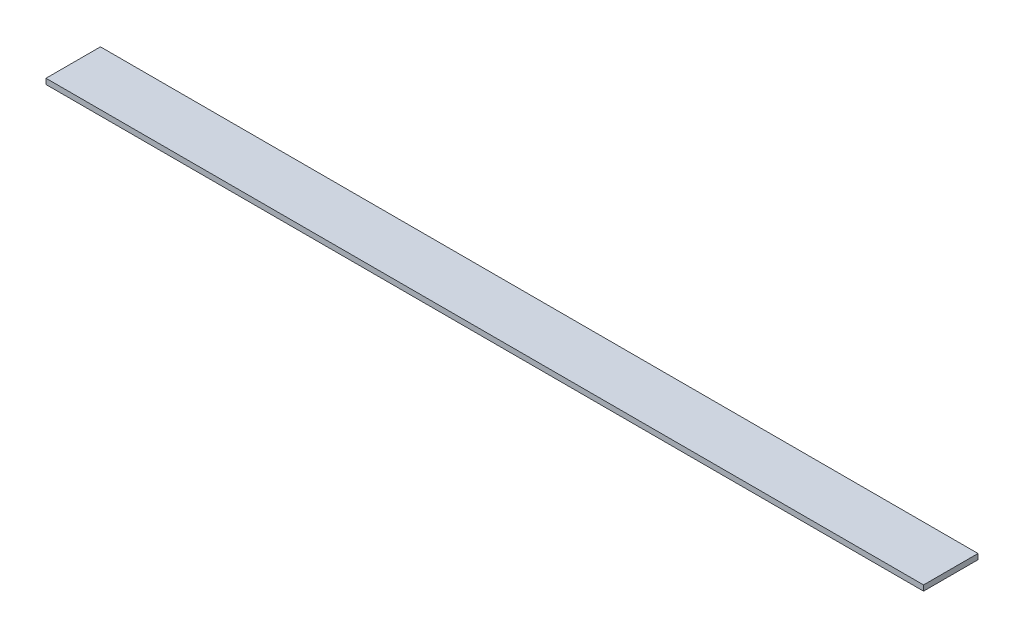
ISO-10303-21;
HEADER;
FILE_DESCRIPTION(('STEP AP214'),'2;1');
FILE_NAME('part.step','',(''),(''),'','','');
FILE_SCHEMA(('AUTOMOTIVE_DESIGN { 1 0 10303 214 1 1 1 1 }'));
ENDSEC;
DATA;
#1=APPLICATION_CONTEXT('core data for automotive mechanical design processes');
#2=APPLICATION_PROTOCOL_DEFINITION('international standard','automotive_design',2000,#1);
#3=PRODUCT_CONTEXT('',#1,'mechanical');
#4=PRODUCT('Part','Part','',(#3));
#5=PRODUCT_RELATED_PRODUCT_CATEGORY('part','',(#4));
#6=PRODUCT_DEFINITION_FORMATION('','',#4);
#7=PRODUCT_DEFINITION_CONTEXT('part definition',#1,'design');
#8=PRODUCT_DEFINITION('design','',#6,#7);
#9=PRODUCT_DEFINITION_SHAPE('','',#8);
#10=(LENGTH_UNIT() NAMED_UNIT(*) SI_UNIT(.MILLI.,.METRE.));
#11=(NAMED_UNIT(*) PLANE_ANGLE_UNIT() SI_UNIT($,.RADIAN.));
#12=(NAMED_UNIT(*) SI_UNIT($,.STERADIAN.) SOLID_ANGLE_UNIT());
#13=UNCERTAINTY_MEASURE_WITH_UNIT(LENGTH_MEASURE(1.E-05),#10,'distance_accuracy_value','');
#14=(GEOMETRIC_REPRESENTATION_CONTEXT(3) GLOBAL_UNCERTAINTY_ASSIGNED_CONTEXT((#13)) GLOBAL_UNIT_ASSIGNED_CONTEXT((#10,
#11,#12)) REPRESENTATION_CONTEXT('',''));
#15=CARTESIAN_POINT('',(0.,0.,0.));
#16=DIRECTION('',(0.,0.,1.));
#17=DIRECTION('',(1.,0.,0.));
#18=AXIS2_PLACEMENT_3D('',#15,#16,#17);
#19=CARTESIAN_POINT('',(0.,15.55,0.));
#20=DIRECTION('',(0.,-1.,0.));
#21=DIRECTION('',(0.,0.,-1.));
#22=AXIS2_PLACEMENT_3D('',#19,#20,#21);
#23=PLANE('',#22);
#24=DIRECTION('',(0.,0.,-1.));
#25=VECTOR('',#24,1.);
#26=CARTESIAN_POINT('',(-40.3,15.55,-56.));
#27=LINE('',#26,#25);
#28=CARTESIAN_POINT('',(-40.3,15.55,-51.));
#29=VERTEX_POINT('',#28);
#30=CARTESIAN_POINT('',(-40.3,15.55,-56.));
#31=VERTEX_POINT('',#30);
#32=EDGE_CURVE('E64',#29,#31,#27,.T.);
#33=ORIENTED_EDGE('',*,*,#32,.T.);
#34=DIRECTION('',(1.,0.,0.));
#35=VECTOR('',#34,1.);
#36=CARTESIAN_POINT('',(40.3,15.55,-56.));
#37=LINE('',#36,#35);
#38=CARTESIAN_POINT('',(40.3,15.55,-56.));
#39=VERTEX_POINT('',#38);
#40=EDGE_CURVE('E93',#31,#39,#37,.T.);
#41=ORIENTED_EDGE('',*,*,#40,.T.);
#42=DIRECTION('',(0.,0.,1.));
#43=VECTOR('',#42,1.);
#44=CARTESIAN_POINT('',(40.3,15.55,-56.));
#45=LINE('',#44,#43);
#46=CARTESIAN_POINT('',(40.3,15.55,-51.));
#47=VERTEX_POINT('',#46);
#48=EDGE_CURVE('E68',#39,#47,#45,.T.);
#49=ORIENTED_EDGE('',*,*,#48,.T.);
#50=DIRECTION('',(-1.,0.,0.));
#51=VECTOR('',#50,1.);
#52=CARTESIAN_POINT('',(40.3,15.55,-51.));
#53=LINE('',#52,#51);
#54=EDGE_CURVE('E20',#47,#29,#53,.T.);
#55=ORIENTED_EDGE('',*,*,#54,.T.);
#56=EDGE_LOOP('',(#33,#41,#49,#55));
#57=FACE_BOUND('',#56,.T.);
#58=ADVANCED_FACE('F17',(#57),#23,.T.);
#59=CARTESIAN_POINT('',(40.3,16.05,-51.));
#60=DIRECTION('',(0.,0.,-1.));
#61=DIRECTION('',(-1.,0.,0.));
#62=AXIS2_PLACEMENT_3D('',#59,#60,#61);
#63=PLANE('',#62);
#64=DIRECTION('',(0.,1.,0.));
#65=VECTOR('',#64,1.);
#66=CARTESIAN_POINT('',(40.3,16.05,-51.));
#67=LINE('',#66,#65);
#68=CARTESIAN_POINT('',(40.3,16.05,-51.));
#69=VERTEX_POINT('',#68);
#70=EDGE_CURVE('E96',#47,#69,#67,.T.);
#71=ORIENTED_EDGE('',*,*,#70,.T.);
#72=DIRECTION('',(1.,0.,0.));
#73=VECTOR('',#72,1.);
#74=CARTESIAN_POINT('',(0.,16.05,-51.));
#75=LINE('',#74,#73);
#76=CARTESIAN_POINT('',(-40.3,16.05,-51.));
#77=VERTEX_POINT('',#76);
#78=EDGE_CURVE('E85',#69,#77,#75,.F.);
#79=ORIENTED_EDGE('',*,*,#78,.T.);
#80=DIRECTION('',(0.,1.,0.));
#81=VECTOR('',#80,1.);
#82=CARTESIAN_POINT('',(-40.3,16.05,-51.));
#83=LINE('',#82,#81);
#84=EDGE_CURVE('E74',#77,#29,#83,.F.);
#85=ORIENTED_EDGE('',*,*,#84,.T.);
#86=ORIENTED_EDGE('',*,*,#54,.F.);
#87=EDGE_LOOP('',(#71,#79,#85,#86));
#88=FACE_BOUND('',#87,.T.);
#89=ADVANCED_FACE('F84',(#88),#63,.F.);
#90=CARTESIAN_POINT('',(-40.3,16.05,-56.));
#91=DIRECTION('',(1.,0.,0.));
#92=DIRECTION('',(0.,0.,-1.));
#93=AXIS2_PLACEMENT_3D('',#90,#91,#92);
#94=PLANE('',#93);
#95=ORIENTED_EDGE('',*,*,#84,.F.);
#96=DIRECTION('',(0.,0.,-1.));
#97=VECTOR('',#96,1.);
#98=CARTESIAN_POINT('',(-40.3,16.05,0.));
#99=LINE('',#98,#97);
#100=CARTESIAN_POINT('',(-40.3,16.05,-56.));
#101=VERTEX_POINT('',#100);
#102=EDGE_CURVE('E103',#77,#101,#99,.T.);
#103=ORIENTED_EDGE('',*,*,#102,.T.);
#104=DIRECTION('',(0.,1.,0.));
#105=VECTOR('',#104,1.);
#106=CARTESIAN_POINT('',(-40.3,16.05,-56.));
#107=LINE('',#106,#105);
#108=EDGE_CURVE('E80',#101,#31,#107,.F.);
#109=ORIENTED_EDGE('',*,*,#108,.T.);
#110=ORIENTED_EDGE('',*,*,#32,.F.);
#111=EDGE_LOOP('',(#95,#103,#109,#110));
#112=FACE_BOUND('',#111,.T.);
#113=ADVANCED_FACE('F77',(#112),#94,.F.);
#114=CARTESIAN_POINT('',(40.3,16.05,-56.));
#115=DIRECTION('',(0.,0.,1.));
#116=DIRECTION('',(1.,0.,0.));
#117=AXIS2_PLACEMENT_3D('',#114,#115,#116);
#118=PLANE('',#117);
#119=ORIENTED_EDGE('',*,*,#108,.F.);
#120=DIRECTION('',(1.,0.,0.));
#121=VECTOR('',#120,1.);
#122=CARTESIAN_POINT('',(0.,16.05,-56.));
#123=LINE('',#122,#121);
#124=CARTESIAN_POINT('',(40.3,16.05,-56.));
#125=VERTEX_POINT('',#124);
#126=EDGE_CURVE('E27',#101,#125,#123,.T.);
#127=ORIENTED_EDGE('',*,*,#126,.T.);
#128=DIRECTION('',(0.,1.,0.));
#129=VECTOR('',#128,1.);
#130=CARTESIAN_POINT('',(40.3,16.05,-56.));
#131=LINE('',#130,#129);
#132=EDGE_CURVE('E39',#125,#39,#131,.F.);
#133=ORIENTED_EDGE('',*,*,#132,.T.);
#134=ORIENTED_EDGE('',*,*,#40,.F.);
#135=EDGE_LOOP('',(#119,#127,#133,#134));
#136=FACE_BOUND('',#135,.T.);
#137=ADVANCED_FACE('F110',(#136),#118,.F.);
#138=CARTESIAN_POINT('',(40.3,16.05,-56.));
#139=DIRECTION('',(-1.,0.,0.));
#140=DIRECTION('',(0.,0.,1.));
#141=AXIS2_PLACEMENT_3D('',#138,#139,#140);
#142=PLANE('',#141);
#143=ORIENTED_EDGE('',*,*,#132,.F.);
#144=DIRECTION('',(0.,0.,-1.));
#145=VECTOR('',#144,1.);
#146=CARTESIAN_POINT('',(40.3,16.05,0.));
#147=LINE('',#146,#145);
#148=EDGE_CURVE('E11',#125,#69,#147,.F.);
#149=ORIENTED_EDGE('',*,*,#148,.T.);
#150=ORIENTED_EDGE('',*,*,#70,.F.);
#151=ORIENTED_EDGE('',*,*,#48,.F.);
#152=EDGE_LOOP('',(#143,#149,#150,#151));
#153=FACE_BOUND('',#152,.T.);
#154=ADVANCED_FACE('F113',(#153),#142,.F.);
#155=CARTESIAN_POINT('',(0.,16.05,0.));
#156=DIRECTION('',(0.,-1.,0.));
#157=DIRECTION('',(0.,0.,-1.));
#158=AXIS2_PLACEMENT_3D('',#155,#156,#157);
#159=PLANE('',#158);
#160=ORIENTED_EDGE('',*,*,#126,.F.);
#161=ORIENTED_EDGE('',*,*,#102,.F.);
#162=ORIENTED_EDGE('',*,*,#78,.F.);
#163=ORIENTED_EDGE('',*,*,#148,.F.);
#164=EDGE_LOOP('',(#160,#161,#162,#163));
#165=FACE_BOUND('',#164,.T.);
#166=ADVANCED_FACE('F112',(#165),#159,.F.);
#167=CLOSED_SHELL('',(#58,#89,#113,#137,#154,#166));
#168=MANIFOLD_SOLID_BREP('B1',#167);
#169=ADVANCED_BREP_SHAPE_REPRESENTATION('',(#18,#168),#14);
#170=SHAPE_DEFINITION_REPRESENTATION(#9,#169);
ENDSEC;
END-ISO-10303-21;
